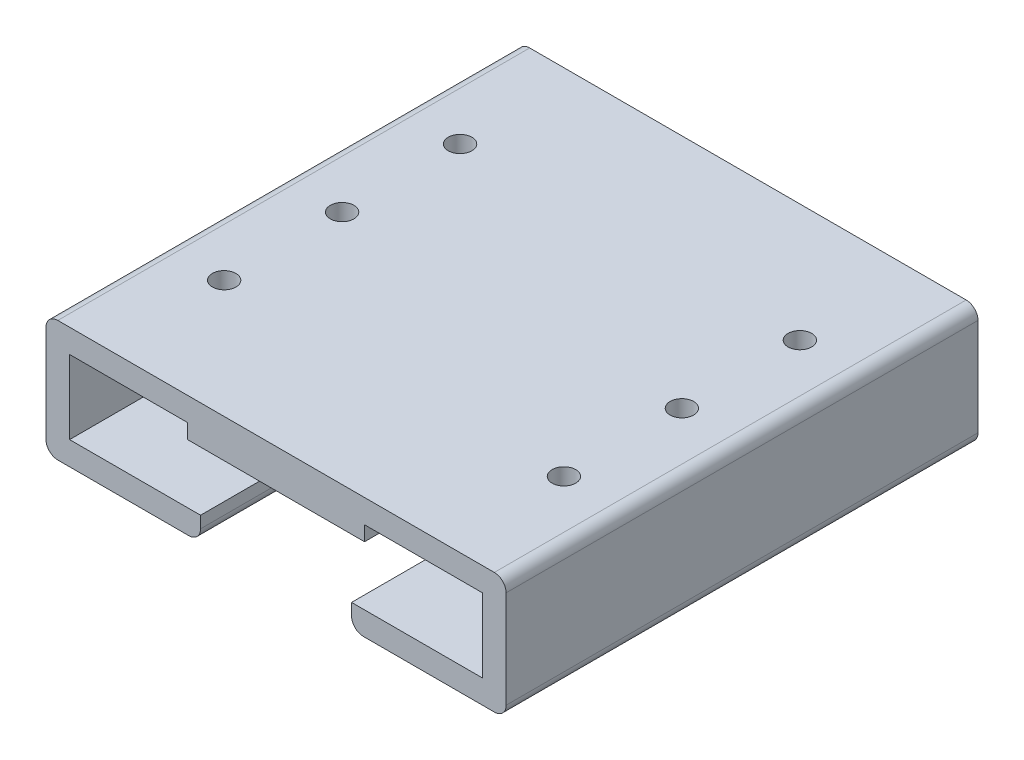
ISO-10303-21;
HEADER;
FILE_DESCRIPTION(('STEP AP214'),'2;1');
FILE_NAME('part.step','',(''),(''),'','','');
FILE_SCHEMA(('AUTOMOTIVE_DESIGN { 1 0 10303 214 1 1 1 1 }'));
ENDSEC;
DATA;
#1=APPLICATION_CONTEXT('core data for automotive mechanical design processes');
#2=APPLICATION_PROTOCOL_DEFINITION('international standard','automotive_design',2000,#1);
#3=PRODUCT_CONTEXT('',#1,'mechanical');
#4=PRODUCT('Part','Part','',(#3));
#5=PRODUCT_RELATED_PRODUCT_CATEGORY('part','',(#4));
#6=PRODUCT_DEFINITION_FORMATION('','',#4);
#7=PRODUCT_DEFINITION_CONTEXT('part definition',#1,'design');
#8=PRODUCT_DEFINITION('design','',#6,#7);
#9=PRODUCT_DEFINITION_SHAPE('','',#8);
#10=(LENGTH_UNIT() NAMED_UNIT(*) SI_UNIT(.MILLI.,.METRE.));
#11=(NAMED_UNIT(*) PLANE_ANGLE_UNIT() SI_UNIT($,.RADIAN.));
#12=(NAMED_UNIT(*) SI_UNIT($,.STERADIAN.) SOLID_ANGLE_UNIT());
#13=UNCERTAINTY_MEASURE_WITH_UNIT(LENGTH_MEASURE(1.E-05),#10,'distance_accuracy_value','');
#14=(GEOMETRIC_REPRESENTATION_CONTEXT(3) GLOBAL_UNCERTAINTY_ASSIGNED_CONTEXT((#13)) GLOBAL_UNIT_ASSIGNED_CONTEXT((#10,
#11,#12)) REPRESENTATION_CONTEXT('',''));
#15=CARTESIAN_POINT('',(0.,0.,0.));
#16=DIRECTION('',(0.,0.,1.));
#17=DIRECTION('',(1.,0.,0.));
#18=AXIS2_PLACEMENT_3D('',#15,#16,#17);
#19=CARTESIAN_POINT('',(15.,0.,80.));
#20=DIRECTION('',(-1.,0.,0.));
#21=DIRECTION('',(0.,0.,1.));
#22=AXIS2_PLACEMENT_3D('',#19,#20,#21);
#23=PLANE('',#22);
#24=DIRECTION('',(0.,1.,0.));
#25=VECTOR('',#24,1.);
#26=CARTESIAN_POINT('',(15.,0.,0.));
#27=LINE('',#26,#25);
#28=CARTESIAN_POINT('',(15.,0.,0.));
#29=VERTEX_POINT('',#28);
#30=CARTESIAN_POINT('',(15.,2.5,0.));
#31=VERTEX_POINT('',#30);
#32=EDGE_CURVE('E228',#29,#31,#27,.T.);
#33=ORIENTED_EDGE('',*,*,#32,.T.);
#34=DIRECTION('',(0.,0.,-1.));
#35=VECTOR('',#34,1.);
#36=CARTESIAN_POINT('',(15.,2.5,80.));
#37=LINE('',#36,#35);
#38=CARTESIAN_POINT('',(15.,2.5,80.));
#39=VERTEX_POINT('',#38);
#40=EDGE_CURVE('E11',#39,#31,#37,.T.);
#41=ORIENTED_EDGE('',*,*,#40,.F.);
#42=DIRECTION('',(0.,1.,0.));
#43=VECTOR('',#42,1.);
#44=CARTESIAN_POINT('',(15.,0.,80.));
#45=LINE('',#44,#43);
#46=CARTESIAN_POINT('',(15.,0.,80.));
#47=VERTEX_POINT('',#46);
#48=EDGE_CURVE('E294',#47,#39,#45,.T.);
#49=ORIENTED_EDGE('',*,*,#48,.F.);
#50=DIRECTION('',(0.,0.,-1.));
#51=VECTOR('',#50,1.);
#52=CARTESIAN_POINT('',(15.,0.,80.));
#53=LINE('',#52,#51);
#54=EDGE_CURVE('E224',#47,#29,#53,.T.);
#55=ORIENTED_EDGE('',*,*,#54,.T.);
#56=EDGE_LOOP('',(#33,#41,#49,#55));
#57=FACE_BOUND('',#56,.T.);
#58=ADVANCED_FACE('F43',(#57),#23,.F.);
#59=CARTESIAN_POINT('',(15.,2.5,80.));
#60=DIRECTION('',(0.,1.,0.));
#61=DIRECTION('',(-1.,0.,0.));
#62=AXIS2_PLACEMENT_3D('',#59,#60,#61);
#63=PLANE('',#62);
#64=CARTESIAN_POINT('',(28.8000000000004,2.50000000000001,20.));
#65=DIRECTION('',(0.,-1.,0.));
#66=DIRECTION('',(1.,0.,0.));
#67=AXIS2_PLACEMENT_3D('',#64,#65,#66);
#68=CIRCLE('',#67,2.00000000000001);
#69=CARTESIAN_POINT('',(30.8000000000004,2.50000000000001,20.));
#70=VERTEX_POINT('',#69);
#71=EDGE_CURVE('E564',#70,#70,#68,.T.);
#72=ORIENTED_EDGE('',*,*,#71,.F.);
#73=EDGE_LOOP('',(#72));
#74=FACE_BOUND('',#73,.T.);
#75=CARTESIAN_POINT('',(28.8000000000002,2.50000000000001,40.));
#76=DIRECTION('',(0.,-1.,0.));
#77=DIRECTION('',(1.,0.,0.));
#78=AXIS2_PLACEMENT_3D('',#75,#76,#77);
#79=CIRCLE('',#78,2.00000000000001);
#80=CARTESIAN_POINT('',(30.8000000000002,2.50000000000001,40.));
#81=VERTEX_POINT('',#80);
#82=EDGE_CURVE('E563',#81,#81,#79,.T.);
#83=ORIENTED_EDGE('',*,*,#82,.F.);
#84=EDGE_LOOP('',(#83));
#85=FACE_BOUND('',#84,.T.);
#86=CARTESIAN_POINT('',(28.8,2.50000000000001,60.));
#87=DIRECTION('',(0.,-1.,0.));
#88=DIRECTION('',(1.,0.,0.));
#89=AXIS2_PLACEMENT_3D('',#86,#87,#88);
#90=CIRCLE('',#89,2.00000000000001);
#91=CARTESIAN_POINT('',(30.8,2.50000000000001,60.));
#92=VERTEX_POINT('',#91);
#93=EDGE_CURVE('E544',#92,#92,#90,.T.);
#94=ORIENTED_EDGE('',*,*,#93,.F.);
#95=EDGE_LOOP('',(#94));
#96=FACE_BOUND('',#95,.T.);
#97=DIRECTION('',(1.,0.,0.));
#98=VECTOR('',#97,1.);
#99=CARTESIAN_POINT('',(15.,2.5,0.));
#100=LINE('',#99,#98);
#101=CARTESIAN_POINT('',(35.,2.5,0.));
#102=VERTEX_POINT('',#101);
#103=EDGE_CURVE('E232',#31,#102,#100,.T.);
#104=ORIENTED_EDGE('',*,*,#103,.T.);
#105=DIRECTION('',(0.,0.,-1.));
#106=VECTOR('',#105,1.);
#107=CARTESIAN_POINT('',(35.,2.5,80.));
#108=LINE('',#107,#106);
#109=CARTESIAN_POINT('',(35.,2.5,80.));
#110=VERTEX_POINT('',#109);
#111=EDGE_CURVE('E52',#110,#102,#108,.T.);
#112=ORIENTED_EDGE('',*,*,#111,.F.);
#113=DIRECTION('',(1.,0.,0.));
#114=VECTOR('',#113,1.);
#115=CARTESIAN_POINT('',(15.,2.5,80.));
#116=LINE('',#115,#114);
#117=EDGE_CURVE('E145',#39,#110,#116,.T.);
#118=ORIENTED_EDGE('',*,*,#117,.F.);
#119=ORIENTED_EDGE('',*,*,#40,.T.);
#120=EDGE_LOOP('',(#104,#112,#118,#119));
#121=FACE_BOUND('',#120,.T.);
#122=ADVANCED_FACE('F458',(#74,#85,#96,#121),#63,.F.);
#123=CARTESIAN_POINT('',(35.,2.5,80.));
#124=DIRECTION('',(1.,0.,0.));
#125=DIRECTION('',(0.,0.,-1.));
#126=AXIS2_PLACEMENT_3D('',#123,#124,#125);
#127=PLANE('',#126);
#128=DIRECTION('',(0.,-1.,0.));
#129=VECTOR('',#128,1.);
#130=CARTESIAN_POINT('',(35.,2.5,0.));
#131=LINE('',#130,#129);
#132=CARTESIAN_POINT('',(35.,-10.,0.));
#133=VERTEX_POINT('',#132);
#134=EDGE_CURVE('E236',#102,#133,#131,.T.);
#135=ORIENTED_EDGE('',*,*,#134,.T.);
#136=DIRECTION('',(0.,0.,-1.));
#137=VECTOR('',#136,1.);
#138=CARTESIAN_POINT('',(35.,-10.,80.));
#139=LINE('',#138,#137);
#140=CARTESIAN_POINT('',(35.,-10.,80.));
#141=VERTEX_POINT('',#140);
#142=EDGE_CURVE('E361',#141,#133,#139,.T.);
#143=ORIENTED_EDGE('',*,*,#142,.F.);
#144=DIRECTION('',(0.,-1.,0.));
#145=VECTOR('',#144,1.);
#146=CARTESIAN_POINT('',(35.,2.5,80.));
#147=LINE('',#146,#145);
#148=EDGE_CURVE('E371',#110,#141,#147,.T.);
#149=ORIENTED_EDGE('',*,*,#148,.F.);
#150=ORIENTED_EDGE('',*,*,#111,.T.);
#151=EDGE_LOOP('',(#135,#143,#149,#150));
#152=FACE_BOUND('',#151,.T.);
#153=ADVANCED_FACE('F369',(#152),#127,.F.);
#154=CARTESIAN_POINT('',(35.,-10.,80.));
#155=DIRECTION('',(0.,-1.,0.));
#156=DIRECTION('',(0.,0.,-1.));
#157=AXIS2_PLACEMENT_3D('',#154,#155,#156);
#158=PLANE('',#157);
#159=CARTESIAN_POINT('',(28.8,-10.,40.));
#160=DIRECTION('',(0.,1.,0.));
#161=DIRECTION('',(0.,0.,1.));
#162=AXIS2_PLACEMENT_3D('',#159,#160,#161);
#163=CIRCLE('',#162,2.00000000000001);
#164=CARTESIAN_POINT('',(28.8,-10.,42.));
#165=VERTEX_POINT('',#164);
#166=EDGE_CURVE('E591',#165,#165,#163,.T.);
#167=ORIENTED_EDGE('',*,*,#166,.F.);
#168=EDGE_LOOP('',(#167));
#169=FACE_BOUND('',#168,.T.);
#170=DIRECTION('',(-1.,0.,0.));
#171=VECTOR('',#170,1.);
#172=CARTESIAN_POINT('',(35.,-10.,0.));
#173=LINE('',#172,#171);
#174=CARTESIAN_POINT('',(12.8,-10.,0.));
#175=VERTEX_POINT('',#174);
#176=EDGE_CURVE('E239',#133,#175,#173,.T.);
#177=ORIENTED_EDGE('',*,*,#176,.T.);
#178=DIRECTION('',(0.,0.,-1.));
#179=VECTOR('',#178,1.);
#180=CARTESIAN_POINT('',(12.8,-10.,80.));
#181=LINE('',#180,#179);
#182=CARTESIAN_POINT('',(12.8,-10.,80.));
#183=VERTEX_POINT('',#182);
#184=EDGE_CURVE('E357',#183,#175,#181,.T.);
#185=ORIENTED_EDGE('',*,*,#184,.F.);
#186=DIRECTION('',(-1.,0.,0.));
#187=VECTOR('',#186,1.);
#188=CARTESIAN_POINT('',(35.,-10.,80.));
#189=LINE('',#188,#187);
#190=EDGE_CURVE('E390',#141,#183,#189,.T.);
#191=ORIENTED_EDGE('',*,*,#190,.F.);
#192=ORIENTED_EDGE('',*,*,#142,.T.);
#193=EDGE_LOOP('',(#177,#185,#191,#192));
#194=FACE_BOUND('',#193,.T.);
#195=ADVANCED_FACE('F380',(#169,#194),#158,.F.);
#196=CARTESIAN_POINT('',(12.8,-10.,80.));
#197=DIRECTION('',(1.,0.,0.));
#198=DIRECTION('',(0.,0.,-1.));
#199=AXIS2_PLACEMENT_3D('',#196,#197,#198);
#200=PLANE('',#199);
#201=DIRECTION('',(0.,-1.,0.));
#202=VECTOR('',#201,1.);
#203=CARTESIAN_POINT('',(12.8,-10.,0.));
#204=LINE('',#203,#202);
#205=CARTESIAN_POINT('',(12.8,-12.,0.));
#206=VERTEX_POINT('',#205);
#207=EDGE_CURVE('E242',#175,#206,#204,.T.);
#208=ORIENTED_EDGE('',*,*,#207,.T.);
#209=DIRECTION('',(0.,0.,-1.));
#210=VECTOR('',#209,1.);
#211=CARTESIAN_POINT('',(12.8,-12.,80.));
#212=LINE('',#211,#210);
#213=CARTESIAN_POINT('',(12.8,-12.,80.));
#214=VERTEX_POINT('',#213);
#215=EDGE_CURVE('E353',#214,#206,#212,.T.);
#216=ORIENTED_EDGE('',*,*,#215,.F.);
#217=DIRECTION('',(0.,-1.,0.));
#218=VECTOR('',#217,1.);
#219=CARTESIAN_POINT('',(12.8,-10.,80.));
#220=LINE('',#219,#218);
#221=EDGE_CURVE('E386',#183,#214,#220,.T.);
#222=ORIENTED_EDGE('',*,*,#221,.F.);
#223=ORIENTED_EDGE('',*,*,#184,.T.);
#224=EDGE_LOOP('',(#208,#216,#222,#223));
#225=FACE_BOUND('',#224,.T.);
#226=ADVANCED_FACE('F384',(#225),#200,.F.);
#227=CARTESIAN_POINT('',(14.8,-12.,80.));
#228=DIRECTION('',(0.,0.,-1.));
#229=DIRECTION('',(-1.,0.,0.));
#230=AXIS2_PLACEMENT_3D('',#227,#228,#229);
#231=CYLINDRICAL_SURFACE('',#230,2.);
#232=CARTESIAN_POINT('',(14.8,-12.,0.));
#233=DIRECTION('',(0.,0.,1.));
#234=DIRECTION('',(-1.,0.,0.));
#235=AXIS2_PLACEMENT_3D('',#232,#233,#234);
#236=CIRCLE('',#235,2.);
#237=CARTESIAN_POINT('',(14.8,-14.,0.));
#238=VERTEX_POINT('',#237);
#239=EDGE_CURVE('E245',#206,#238,#236,.T.);
#240=ORIENTED_EDGE('',*,*,#239,.T.);
#241=DIRECTION('',(0.,0.,-1.));
#242=VECTOR('',#241,1.);
#243=CARTESIAN_POINT('',(14.8,-14.,80.));
#244=LINE('',#243,#242);
#245=CARTESIAN_POINT('',(14.8,-14.,80.));
#246=VERTEX_POINT('',#245);
#247=EDGE_CURVE('E349',#246,#238,#244,.T.);
#248=ORIENTED_EDGE('',*,*,#247,.F.);
#249=CARTESIAN_POINT('',(14.8,-12.,80.));
#250=DIRECTION('',(0.,0.,1.));
#251=DIRECTION('',(-1.,0.,0.));
#252=AXIS2_PLACEMENT_3D('',#249,#250,#251);
#253=CIRCLE('',#252,2.);
#254=EDGE_CURVE('E389',#214,#246,#253,.T.);
#255=ORIENTED_EDGE('',*,*,#254,.F.);
#256=ORIENTED_EDGE('',*,*,#215,.T.);
#257=EDGE_LOOP('',(#240,#248,#255,#256));
#258=FACE_BOUND('',#257,.T.);
#259=ADVANCED_FACE('F475',(#258),#231,.T.);
#260=CARTESIAN_POINT('',(37.,-14.,80.));
#261=DIRECTION('',(0.,1.,0.));
#262=DIRECTION('',(-1.,0.,0.));
#263=AXIS2_PLACEMENT_3D('',#260,#261,#262);
#264=PLANE('',#263);
#265=CARTESIAN_POINT('',(28.8,-14.,40.));
#266=DIRECTION('',(0.,1.,0.));
#267=DIRECTION('',(0.,0.,1.));
#268=AXIS2_PLACEMENT_3D('',#265,#266,#267);
#269=CIRCLE('',#268,2.00000000000001);
#270=CARTESIAN_POINT('',(28.8,-14.,42.));
#271=VERTEX_POINT('',#270);
#272=EDGE_CURVE('E588',#271,#271,#269,.T.);
#273=ORIENTED_EDGE('',*,*,#272,.T.);
#274=EDGE_LOOP('',(#273));
#275=FACE_BOUND('',#274,.T.);
#276=DIRECTION('',(1.,0.,0.));
#277=VECTOR('',#276,1.);
#278=CARTESIAN_POINT('',(37.,-14.,0.));
#279=LINE('',#278,#277);
#280=CARTESIAN_POINT('',(37.,-14.,0.));
#281=VERTEX_POINT('',#280);
#282=EDGE_CURVE('E248',#238,#281,#279,.T.);
#283=ORIENTED_EDGE('',*,*,#282,.T.);
#284=DIRECTION('',(0.,0.,-1.));
#285=VECTOR('',#284,1.);
#286=CARTESIAN_POINT('',(37.,-14.,80.));
#287=LINE('',#286,#285);
#288=CARTESIAN_POINT('',(37.,-14.,80.));
#289=VERTEX_POINT('',#288);
#290=EDGE_CURVE('E345',#289,#281,#287,.T.);
#291=ORIENTED_EDGE('',*,*,#290,.F.);
#292=DIRECTION('',(1.,0.,0.));
#293=VECTOR('',#292,1.);
#294=CARTESIAN_POINT('',(37.,-14.,80.));
#295=LINE('',#294,#293);
#296=EDGE_CURVE('E394',#246,#289,#295,.T.);
#297=ORIENTED_EDGE('',*,*,#296,.F.);
#298=ORIENTED_EDGE('',*,*,#247,.T.);
#299=EDGE_LOOP('',(#283,#291,#297,#298));
#300=FACE_BOUND('',#299,.T.);
#301=ADVANCED_FACE('F478',(#275,#300),#264,.F.);
#302=CARTESIAN_POINT('',(37.,-12.,80.));
#303=DIRECTION('',(0.,0.,-1.));
#304=DIRECTION('',(-1.,0.,0.));
#305=AXIS2_PLACEMENT_3D('',#302,#303,#304);
#306=CYLINDRICAL_SURFACE('',#305,2.);
#307=CARTESIAN_POINT('',(37.,-12.,0.));
#308=DIRECTION('',(0.,0.,1.));
#309=DIRECTION('',(-1.,0.,0.));
#310=AXIS2_PLACEMENT_3D('',#307,#308,#309);
#311=CIRCLE('',#310,2.);
#312=CARTESIAN_POINT('',(39.,-12.,0.));
#313=VERTEX_POINT('',#312);
#314=EDGE_CURVE('E251',#281,#313,#311,.T.);
#315=ORIENTED_EDGE('',*,*,#314,.T.);
#316=DIRECTION('',(0.,0.,-1.));
#317=VECTOR('',#316,1.);
#318=CARTESIAN_POINT('',(39.,-12.,80.));
#319=LINE('',#318,#317);
#320=CARTESIAN_POINT('',(39.,-12.,80.));
#321=VERTEX_POINT('',#320);
#322=EDGE_CURVE('E341',#321,#313,#319,.T.);
#323=ORIENTED_EDGE('',*,*,#322,.F.);
#324=CARTESIAN_POINT('',(37.,-12.,80.));
#325=DIRECTION('',(0.,0.,1.));
#326=DIRECTION('',(-1.,0.,0.));
#327=AXIS2_PLACEMENT_3D('',#324,#325,#326);
#328=CIRCLE('',#327,2.);
#329=EDGE_CURVE('E401',#289,#321,#328,.T.);
#330=ORIENTED_EDGE('',*,*,#329,.F.);
#331=ORIENTED_EDGE('',*,*,#290,.T.);
#332=EDGE_LOOP('',(#315,#323,#330,#331));
#333=FACE_BOUND('',#332,.T.);
#334=ADVANCED_FACE('F482',(#333),#306,.T.);
#335=CARTESIAN_POINT('',(39.,4.49999999999998,80.));
#336=DIRECTION('',(-1.,0.,0.));
#337=DIRECTION('',(0.,0.,1.));
#338=AXIS2_PLACEMENT_3D('',#335,#336,#337);
#339=PLANE('',#338);
#340=DIRECTION('',(0.,1.,0.));
#341=VECTOR('',#340,1.);
#342=CARTESIAN_POINT('',(39.,4.49999999999998,0.));
#343=LINE('',#342,#341);
#344=CARTESIAN_POINT('',(39.,4.49999999999998,0.));
#345=VERTEX_POINT('',#344);
#346=EDGE_CURVE('E254',#313,#345,#343,.T.);
#347=ORIENTED_EDGE('',*,*,#346,.T.);
#348=DIRECTION('',(0.,0.,-1.));
#349=VECTOR('',#348,1.);
#350=CARTESIAN_POINT('',(39.,4.49999999999998,80.));
#351=LINE('',#350,#349);
#352=CARTESIAN_POINT('',(39.,4.49999999999998,80.));
#353=VERTEX_POINT('',#352);
#354=EDGE_CURVE('E337',#353,#345,#351,.T.);
#355=ORIENTED_EDGE('',*,*,#354,.F.);
#356=DIRECTION('',(0.,1.,0.));
#357=VECTOR('',#356,1.);
#358=CARTESIAN_POINT('',(39.,4.49999999999998,80.));
#359=LINE('',#358,#357);
#360=EDGE_CURVE('E404',#321,#353,#359,.T.);
#361=ORIENTED_EDGE('',*,*,#360,.F.);
#362=ORIENTED_EDGE('',*,*,#322,.T.);
#363=EDGE_LOOP('',(#347,#355,#361,#362));
#364=FACE_BOUND('',#363,.T.);
#365=ADVANCED_FACE('F486',(#364),#339,.F.);
#366=CARTESIAN_POINT('',(37.,4.5,80.));
#367=DIRECTION('',(0.,0.,-1.));
#368=DIRECTION('',(-1.,0.,0.));
#369=AXIS2_PLACEMENT_3D('',#366,#367,#368);
#370=CYLINDRICAL_SURFACE('',#369,2.);
#371=CARTESIAN_POINT('',(37.,4.5,0.));
#372=DIRECTION('',(0.,0.,1.));
#373=DIRECTION('',(-1.,0.,0.));
#374=AXIS2_PLACEMENT_3D('',#371,#372,#373);
#375=CIRCLE('',#374,2.);
#376=CARTESIAN_POINT('',(37.,6.5,0.));
#377=VERTEX_POINT('',#376);
#378=EDGE_CURVE('E257',#345,#377,#375,.T.);
#379=ORIENTED_EDGE('',*,*,#378,.T.);
#380=DIRECTION('',(0.,0.,-1.));
#381=VECTOR('',#380,1.);
#382=CARTESIAN_POINT('',(37.,6.5,80.));
#383=LINE('',#382,#381);
#384=CARTESIAN_POINT('',(37.,6.5,80.));
#385=VERTEX_POINT('',#384);
#386=EDGE_CURVE('E333',#385,#377,#383,.T.);
#387=ORIENTED_EDGE('',*,*,#386,.F.);
#388=CARTESIAN_POINT('',(37.,4.5,80.));
#389=DIRECTION('',(0.,0.,1.));
#390=DIRECTION('',(-1.,0.,0.));
#391=AXIS2_PLACEMENT_3D('',#388,#389,#390);
#392=CIRCLE('',#391,2.);
#393=EDGE_CURVE('E407',#353,#385,#392,.T.);
#394=ORIENTED_EDGE('',*,*,#393,.F.);
#395=ORIENTED_EDGE('',*,*,#354,.T.);
#396=EDGE_LOOP('',(#379,#387,#394,#395));
#397=FACE_BOUND('',#396,.T.);
#398=ADVANCED_FACE('F490',(#397),#370,.T.);
#399=CARTESIAN_POINT('',(-15.,6.5,80.));
#400=DIRECTION('',(0.,-1.,0.));
#401=DIRECTION('',(0.,0.,-1.));
#402=AXIS2_PLACEMENT_3D('',#399,#400,#401);
#403=PLANE('',#402);
#404=CARTESIAN_POINT('',(-28.7999999999998,6.5,40.));
#405=DIRECTION('',(0.,-1.,0.));
#406=DIRECTION('',(1.,0.,0.));
#407=AXIS2_PLACEMENT_3D('',#404,#405,#406);
#408=CIRCLE('',#407,2.00000000000001);
#409=CARTESIAN_POINT('',(-26.7999999999998,6.5,40.));
#410=VERTEX_POINT('',#409);
#411=EDGE_CURVE('E571',#410,#410,#408,.T.);
#412=ORIENTED_EDGE('',*,*,#411,.T.);
#413=EDGE_LOOP('',(#412));
#414=FACE_BOUND('',#413,.T.);
#415=CARTESIAN_POINT('',(28.8000000000004,6.50000000000001,20.));
#416=DIRECTION('',(0.,-1.,0.));
#417=DIRECTION('',(1.,0.,0.));
#418=AXIS2_PLACEMENT_3D('',#415,#416,#417);
#419=CIRCLE('',#418,2.00000000000001);
#420=CARTESIAN_POINT('',(30.8000000000004,6.50000000000001,20.));
#421=VERTEX_POINT('',#420);
#422=EDGE_CURVE('E577',#421,#421,#419,.T.);
#423=ORIENTED_EDGE('',*,*,#422,.T.);
#424=EDGE_LOOP('',(#423));
#425=FACE_BOUND('',#424,.T.);
#426=CARTESIAN_POINT('',(28.8000000000002,6.50000000000001,40.));
#427=DIRECTION('',(0.,-1.,0.));
#428=DIRECTION('',(1.,0.,0.));
#429=AXIS2_PLACEMENT_3D('',#426,#427,#428);
#430=CIRCLE('',#429,2.00000000000001);
#431=CARTESIAN_POINT('',(30.8000000000002,6.50000000000001,40.));
#432=VERTEX_POINT('',#431);
#433=EDGE_CURVE('E559',#432,#432,#430,.T.);
#434=ORIENTED_EDGE('',*,*,#433,.T.);
#435=EDGE_LOOP('',(#434));
#436=FACE_BOUND('',#435,.T.);
#437=CARTESIAN_POINT('',(28.8,6.50000000000001,60.));
#438=DIRECTION('',(0.,-1.,0.));
#439=DIRECTION('',(1.,0.,0.));
#440=AXIS2_PLACEMENT_3D('',#437,#438,#439);
#441=CIRCLE('',#440,2.00000000000001);
#442=CARTESIAN_POINT('',(30.8,6.50000000000001,60.));
#443=VERTEX_POINT('',#442);
#444=EDGE_CURVE('E551',#443,#443,#441,.T.);
#445=ORIENTED_EDGE('',*,*,#444,.T.);
#446=EDGE_LOOP('',(#445));
#447=FACE_BOUND('',#446,.T.);
#448=CARTESIAN_POINT('',(-28.7999999999996,6.5,20.));
#449=DIRECTION('',(0.,-1.,0.));
#450=DIRECTION('',(1.,0.,0.));
#451=AXIS2_PLACEMENT_3D('',#448,#449,#450);
#452=CIRCLE('',#451,2.00000000000001);
#453=CARTESIAN_POINT('',(-26.7999999999996,6.5,20.));
#454=VERTEX_POINT('',#453);
#455=EDGE_CURVE('E584',#454,#454,#452,.T.);
#456=ORIENTED_EDGE('',*,*,#455,.T.);
#457=EDGE_LOOP('',(#456));
#458=FACE_BOUND('',#457,.T.);
#459=CARTESIAN_POINT('',(-28.8,6.5,60.));
#460=DIRECTION('',(0.,-1.,0.));
#461=DIRECTION('',(1.,0.,0.));
#462=AXIS2_PLACEMENT_3D('',#459,#460,#461);
#463=CIRCLE('',#462,2.00000000000001);
#464=CARTESIAN_POINT('',(-26.8,6.5,60.));
#465=VERTEX_POINT('',#464);
#466=EDGE_CURVE('E233',#465,#465,#463,.T.);
#467=ORIENTED_EDGE('',*,*,#466,.T.);
#468=EDGE_LOOP('',(#467));
#469=FACE_BOUND('',#468,.T.);
#470=DIRECTION('',(-1.,0.,0.));
#471=VECTOR('',#470,1.);
#472=CARTESIAN_POINT('',(-15.,6.5,0.));
#473=LINE('',#472,#471);
#474=CARTESIAN_POINT('',(-37.,6.5,0.));
#475=VERTEX_POINT('',#474);
#476=EDGE_CURVE('E261',#377,#475,#473,.T.);
#477=ORIENTED_EDGE('',*,*,#476,.T.);
#478=DIRECTION('',(0.,0.,-1.));
#479=VECTOR('',#478,1.);
#480=CARTESIAN_POINT('',(-37.,6.5,80.));
#481=LINE('',#480,#479);
#482=CARTESIAN_POINT('',(-37.,6.5,80.));
#483=VERTEX_POINT('',#482);
#484=EDGE_CURVE('E329',#483,#475,#481,.T.);
#485=ORIENTED_EDGE('',*,*,#484,.F.);
#486=DIRECTION('',(-1.,0.,0.));
#487=VECTOR('',#486,1.);
#488=CARTESIAN_POINT('',(15.,6.5,80.));
#489=LINE('',#488,#487);
#490=EDGE_CURVE('E410',#385,#483,#489,.T.);
#491=ORIENTED_EDGE('',*,*,#490,.F.);
#492=ORIENTED_EDGE('',*,*,#386,.T.);
#493=EDGE_LOOP('',(#477,#485,#491,#492));
#494=FACE_BOUND('',#493,.T.);
#495=ADVANCED_FACE('F494',(#414,#425,#436,#447,#458,#469,#494),#403,.F.);
#496=CARTESIAN_POINT('',(-37.,4.5,80.));
#497=DIRECTION('',(0.,0.,-1.));
#498=DIRECTION('',(-1.,0.,0.));
#499=AXIS2_PLACEMENT_3D('',#496,#497,#498);
#500=CYLINDRICAL_SURFACE('',#499,2.);
#501=CARTESIAN_POINT('',(-37.,4.5,0.));
#502=DIRECTION('',(0.,0.,1.));
#503=DIRECTION('',(1.,0.,0.));
#504=AXIS2_PLACEMENT_3D('',#501,#502,#503);
#505=CIRCLE('',#504,2.);
#506=CARTESIAN_POINT('',(-39.,4.49999999999999,0.));
#507=VERTEX_POINT('',#506);
#508=EDGE_CURVE('E264',#475,#507,#505,.T.);
#509=ORIENTED_EDGE('',*,*,#508,.T.);
#510=DIRECTION('',(0.,0.,-1.));
#511=VECTOR('',#510,1.);
#512=CARTESIAN_POINT('',(-39.,4.49999999999999,80.));
#513=LINE('',#512,#511);
#514=CARTESIAN_POINT('',(-39.,4.49999999999999,80.));
#515=VERTEX_POINT('',#514);
#516=EDGE_CURVE('E325',#515,#507,#513,.T.);
#517=ORIENTED_EDGE('',*,*,#516,.F.);
#518=CARTESIAN_POINT('',(-37.,4.5,80.));
#519=DIRECTION('',(0.,0.,1.));
#520=DIRECTION('',(1.,0.,0.));
#521=AXIS2_PLACEMENT_3D('',#518,#519,#520);
#522=CIRCLE('',#521,2.);
#523=EDGE_CURVE('E413',#483,#515,#522,.T.);
#524=ORIENTED_EDGE('',*,*,#523,.F.);
#525=ORIENTED_EDGE('',*,*,#484,.T.);
#526=EDGE_LOOP('',(#509,#517,#524,#525));
#527=FACE_BOUND('',#526,.T.);
#528=ADVANCED_FACE('F498',(#527),#500,.T.);
#529=CARTESIAN_POINT('',(-39.,4.49999999999999,80.));
#530=DIRECTION('',(1.,0.,0.));
#531=DIRECTION('',(0.,0.,-1.));
#532=AXIS2_PLACEMENT_3D('',#529,#530,#531);
#533=PLANE('',#532);
#534=DIRECTION('',(0.,-1.,0.));
#535=VECTOR('',#534,1.);
#536=CARTESIAN_POINT('',(-39.,4.49999999999999,0.));
#537=LINE('',#536,#535);
#538=CARTESIAN_POINT('',(-39.,-12.,0.));
#539=VERTEX_POINT('',#538);
#540=EDGE_CURVE('E267',#507,#539,#537,.T.);
#541=ORIENTED_EDGE('',*,*,#540,.T.);
#542=DIRECTION('',(0.,0.,-1.));
#543=VECTOR('',#542,1.);
#544=CARTESIAN_POINT('',(-39.,-12.,80.));
#545=LINE('',#544,#543);
#546=CARTESIAN_POINT('',(-39.,-12.,80.));
#547=VERTEX_POINT('',#546);
#548=EDGE_CURVE('E321',#547,#539,#545,.T.);
#549=ORIENTED_EDGE('',*,*,#548,.F.);
#550=DIRECTION('',(0.,-1.,0.));
#551=VECTOR('',#550,1.);
#552=CARTESIAN_POINT('',(-39.,4.49999999999999,80.));
#553=LINE('',#552,#551);
#554=EDGE_CURVE('E416',#515,#547,#553,.T.);
#555=ORIENTED_EDGE('',*,*,#554,.F.);
#556=ORIENTED_EDGE('',*,*,#516,.T.);
#557=EDGE_LOOP('',(#541,#549,#555,#556));
#558=FACE_BOUND('',#557,.T.);
#559=ADVANCED_FACE('F502',(#558),#533,.F.);
#560=CARTESIAN_POINT('',(-37.,-12.,80.));
#561=DIRECTION('',(0.,0.,-1.));
#562=DIRECTION('',(-1.,0.,0.));
#563=AXIS2_PLACEMENT_3D('',#560,#561,#562);
#564=CYLINDRICAL_SURFACE('',#563,2.);
#565=CARTESIAN_POINT('',(-37.,-12.,0.));
#566=DIRECTION('',(0.,0.,1.));
#567=DIRECTION('',(1.,0.,0.));
#568=AXIS2_PLACEMENT_3D('',#565,#566,#567);
#569=CIRCLE('',#568,2.);
#570=CARTESIAN_POINT('',(-37.,-14.,0.));
#571=VERTEX_POINT('',#570);
#572=EDGE_CURVE('E270',#539,#571,#569,.T.);
#573=ORIENTED_EDGE('',*,*,#572,.T.);
#574=DIRECTION('',(0.,0.,-1.));
#575=VECTOR('',#574,1.);
#576=CARTESIAN_POINT('',(-37.,-14.,80.));
#577=LINE('',#576,#575);
#578=CARTESIAN_POINT('',(-37.,-14.,80.));
#579=VERTEX_POINT('',#578);
#580=EDGE_CURVE('E317',#579,#571,#577,.T.);
#581=ORIENTED_EDGE('',*,*,#580,.F.);
#582=CARTESIAN_POINT('',(-37.,-12.,80.));
#583=DIRECTION('',(0.,0.,1.));
#584=DIRECTION('',(1.,0.,0.));
#585=AXIS2_PLACEMENT_3D('',#582,#583,#584);
#586=CIRCLE('',#585,2.);
#587=EDGE_CURVE('E419',#547,#579,#586,.T.);
#588=ORIENTED_EDGE('',*,*,#587,.F.);
#589=ORIENTED_EDGE('',*,*,#548,.T.);
#590=EDGE_LOOP('',(#573,#581,#588,#589));
#591=FACE_BOUND('',#590,.T.);
#592=ADVANCED_FACE('F506',(#591),#564,.T.);
#593=CARTESIAN_POINT('',(-37.,-14.,80.));
#594=DIRECTION('',(0.,1.,0.));
#595=DIRECTION('',(-1.,0.,0.));
#596=AXIS2_PLACEMENT_3D('',#593,#594,#595);
#597=PLANE('',#596);
#598=DIRECTION('',(1.,0.,0.));
#599=VECTOR('',#598,1.);
#600=CARTESIAN_POINT('',(-37.,-14.,0.));
#601=LINE('',#600,#599);
#602=CARTESIAN_POINT('',(-14.8,-14.,0.));
#603=VERTEX_POINT('',#602);
#604=EDGE_CURVE('E273',#571,#603,#601,.T.);
#605=ORIENTED_EDGE('',*,*,#604,.T.);
#606=DIRECTION('',(0.,0.,-1.));
#607=VECTOR('',#606,1.);
#608=CARTESIAN_POINT('',(-14.8,-14.,80.));
#609=LINE('',#608,#607);
#610=CARTESIAN_POINT('',(-14.8,-14.,80.));
#611=VERTEX_POINT('',#610);
#612=EDGE_CURVE('E313',#611,#603,#609,.T.);
#613=ORIENTED_EDGE('',*,*,#612,.F.);
#614=DIRECTION('',(1.,0.,0.));
#615=VECTOR('',#614,1.);
#616=CARTESIAN_POINT('',(-37.,-14.,80.));
#617=LINE('',#616,#615);
#618=EDGE_CURVE('E422',#579,#611,#617,.T.);
#619=ORIENTED_EDGE('',*,*,#618,.F.);
#620=ORIENTED_EDGE('',*,*,#580,.T.);
#621=EDGE_LOOP('',(#605,#613,#619,#620));
#622=FACE_BOUND('',#621,.T.);
#623=ADVANCED_FACE('F510',(#622),#597,.F.);
#624=CARTESIAN_POINT('',(-14.8,-12.,80.));
#625=DIRECTION('',(0.,0.,-1.));
#626=DIRECTION('',(-1.,0.,0.));
#627=AXIS2_PLACEMENT_3D('',#624,#625,#626);
#628=CYLINDRICAL_SURFACE('',#627,2.);
#629=CARTESIAN_POINT('',(-14.8,-12.,0.));
#630=DIRECTION('',(0.,0.,1.));
#631=DIRECTION('',(1.,0.,0.));
#632=AXIS2_PLACEMENT_3D('',#629,#630,#631);
#633=CIRCLE('',#632,2.);
#634=CARTESIAN_POINT('',(-12.8,-12.,0.));
#635=VERTEX_POINT('',#634);
#636=EDGE_CURVE('E276',#603,#635,#633,.T.);
#637=ORIENTED_EDGE('',*,*,#636,.T.);
#638=DIRECTION('',(0.,0.,-1.));
#639=VECTOR('',#638,1.);
#640=CARTESIAN_POINT('',(-12.8,-12.,80.));
#641=LINE('',#640,#639);
#642=CARTESIAN_POINT('',(-12.8,-12.,80.));
#643=VERTEX_POINT('',#642);
#644=EDGE_CURVE('E309',#643,#635,#641,.T.);
#645=ORIENTED_EDGE('',*,*,#644,.F.);
#646=CARTESIAN_POINT('',(-14.8,-12.,80.));
#647=DIRECTION('',(0.,0.,1.));
#648=DIRECTION('',(1.,0.,0.));
#649=AXIS2_PLACEMENT_3D('',#646,#647,#648);
#650=CIRCLE('',#649,2.);
#651=EDGE_CURVE('E425',#611,#643,#650,.T.);
#652=ORIENTED_EDGE('',*,*,#651,.F.);
#653=ORIENTED_EDGE('',*,*,#612,.T.);
#654=EDGE_LOOP('',(#637,#645,#652,#653));
#655=FACE_BOUND('',#654,.T.);
#656=ADVANCED_FACE('F514',(#655),#628,.T.);
#657=CARTESIAN_POINT('',(-12.8,-10.,80.));
#658=DIRECTION('',(-1.,0.,0.));
#659=DIRECTION('',(0.,0.,1.));
#660=AXIS2_PLACEMENT_3D('',#657,#658,#659);
#661=PLANE('',#660);
#662=DIRECTION('',(0.,1.,0.));
#663=VECTOR('',#662,1.);
#664=CARTESIAN_POINT('',(-12.8,-10.,0.));
#665=LINE('',#664,#663);
#666=CARTESIAN_POINT('',(-12.8,-10.,0.));
#667=VERTEX_POINT('',#666);
#668=EDGE_CURVE('E279',#635,#667,#665,.T.);
#669=ORIENTED_EDGE('',*,*,#668,.T.);
#670=DIRECTION('',(0.,0.,-1.));
#671=VECTOR('',#670,1.);
#672=CARTESIAN_POINT('',(-12.8,-10.,80.));
#673=LINE('',#672,#671);
#674=CARTESIAN_POINT('',(-12.8,-10.,80.));
#675=VERTEX_POINT('',#674);
#676=EDGE_CURVE('E305',#675,#667,#673,.T.);
#677=ORIENTED_EDGE('',*,*,#676,.F.);
#678=DIRECTION('',(0.,1.,0.));
#679=VECTOR('',#678,1.);
#680=CARTESIAN_POINT('',(-12.8,-10.,80.));
#681=LINE('',#680,#679);
#682=EDGE_CURVE('E428',#643,#675,#681,.T.);
#683=ORIENTED_EDGE('',*,*,#682,.F.);
#684=ORIENTED_EDGE('',*,*,#644,.T.);
#685=EDGE_LOOP('',(#669,#677,#683,#684));
#686=FACE_BOUND('',#685,.T.);
#687=ADVANCED_FACE('F518',(#686),#661,.F.);
#688=CARTESIAN_POINT('',(-35.,-10.,80.));
#689=DIRECTION('',(0.,-1.,0.));
#690=DIRECTION('',(0.,0.,-1.));
#691=AXIS2_PLACEMENT_3D('',#688,#689,#690);
#692=PLANE('',#691);
#693=DIRECTION('',(-1.,0.,0.));
#694=VECTOR('',#693,1.);
#695=CARTESIAN_POINT('',(-35.,-10.,0.));
#696=LINE('',#695,#694);
#697=CARTESIAN_POINT('',(-35.,-10.,0.));
#698=VERTEX_POINT('',#697);
#699=EDGE_CURVE('E282',#667,#698,#696,.T.);
#700=ORIENTED_EDGE('',*,*,#699,.T.);
#701=DIRECTION('',(0.,0.,-1.));
#702=VECTOR('',#701,1.);
#703=CARTESIAN_POINT('',(-35.,-10.,80.));
#704=LINE('',#703,#702);
#705=CARTESIAN_POINT('',(-35.,-10.,80.));
#706=VERTEX_POINT('',#705);
#707=EDGE_CURVE('E301',#706,#698,#704,.T.);
#708=ORIENTED_EDGE('',*,*,#707,.F.);
#709=DIRECTION('',(-1.,0.,0.));
#710=VECTOR('',#709,1.);
#711=CARTESIAN_POINT('',(-35.,-10.,80.));
#712=LINE('',#711,#710);
#713=EDGE_CURVE('E431',#675,#706,#712,.T.);
#714=ORIENTED_EDGE('',*,*,#713,.F.);
#715=ORIENTED_EDGE('',*,*,#676,.T.);
#716=EDGE_LOOP('',(#700,#708,#714,#715));
#717=FACE_BOUND('',#716,.T.);
#718=ADVANCED_FACE('F439',(#717),#692,.F.);
#719=CARTESIAN_POINT('',(-35.,2.5,80.));
#720=DIRECTION('',(-1.,0.,0.));
#721=DIRECTION('',(0.,0.,1.));
#722=AXIS2_PLACEMENT_3D('',#719,#720,#721);
#723=PLANE('',#722);
#724=DIRECTION('',(0.,1.,0.));
#725=VECTOR('',#724,1.);
#726=CARTESIAN_POINT('',(-35.,2.5,0.));
#727=LINE('',#726,#725);
#728=CARTESIAN_POINT('',(-35.,2.5,0.));
#729=VERTEX_POINT('',#728);
#730=EDGE_CURVE('E285',#698,#729,#727,.T.);
#731=ORIENTED_EDGE('',*,*,#730,.T.);
#732=DIRECTION('',(0.,0.,-1.));
#733=VECTOR('',#732,1.);
#734=CARTESIAN_POINT('',(-35.,2.5,80.));
#735=LINE('',#734,#733);
#736=CARTESIAN_POINT('',(-35.,2.5,80.));
#737=VERTEX_POINT('',#736);
#738=EDGE_CURVE('E217',#737,#729,#735,.T.);
#739=ORIENTED_EDGE('',*,*,#738,.F.);
#740=DIRECTION('',(0.,1.,0.));
#741=VECTOR('',#740,1.);
#742=CARTESIAN_POINT('',(-35.,2.5,80.));
#743=LINE('',#742,#741);
#744=EDGE_CURVE('E206',#706,#737,#743,.T.);
#745=ORIENTED_EDGE('',*,*,#744,.F.);
#746=ORIENTED_EDGE('',*,*,#707,.T.);
#747=EDGE_LOOP('',(#731,#739,#745,#746));
#748=FACE_BOUND('',#747,.T.);
#749=ADVANCED_FACE('F443',(#748),#723,.F.);
#750=CARTESIAN_POINT('',(-15.,2.5,80.));
#751=DIRECTION('',(0.,1.,0.));
#752=DIRECTION('',(-1.,0.,0.));
#753=AXIS2_PLACEMENT_3D('',#750,#751,#752);
#754=PLANE('',#753);
#755=CARTESIAN_POINT('',(-28.7999999999998,2.5,40.));
#756=DIRECTION('',(0.,-1.,0.));
#757=DIRECTION('',(1.,0.,0.));
#758=AXIS2_PLACEMENT_3D('',#755,#756,#757);
#759=CIRCLE('',#758,2.00000000000001);
#760=CARTESIAN_POINT('',(-26.7999999999998,2.5,40.));
#761=VERTEX_POINT('',#760);
#762=EDGE_CURVE('E534',#761,#761,#759,.T.);
#763=ORIENTED_EDGE('',*,*,#762,.F.);
#764=EDGE_LOOP('',(#763));
#765=FACE_BOUND('',#764,.T.);
#766=CARTESIAN_POINT('',(-28.7999999999996,2.5,20.));
#767=DIRECTION('',(0.,-1.,0.));
#768=DIRECTION('',(1.,0.,0.));
#769=AXIS2_PLACEMENT_3D('',#766,#767,#768);
#770=CIRCLE('',#769,2.00000000000001);
#771=CARTESIAN_POINT('',(-26.7999999999996,2.5,20.));
#772=VERTEX_POINT('',#771);
#773=EDGE_CURVE('E538',#772,#772,#770,.T.);
#774=ORIENTED_EDGE('',*,*,#773,.F.);
#775=EDGE_LOOP('',(#774));
#776=FACE_BOUND('',#775,.T.);
#777=CARTESIAN_POINT('',(-28.8,2.5,60.));
#778=DIRECTION('',(0.,-1.,0.));
#779=DIRECTION('',(1.,0.,0.));
#780=AXIS2_PLACEMENT_3D('',#777,#778,#779);
#781=CIRCLE('',#780,2.00000000000001);
#782=CARTESIAN_POINT('',(-26.8,2.5,60.));
#783=VERTEX_POINT('',#782);
#784=EDGE_CURVE('E541',#783,#783,#781,.T.);
#785=ORIENTED_EDGE('',*,*,#784,.F.);
#786=EDGE_LOOP('',(#785));
#787=FACE_BOUND('',#786,.T.);
#788=DIRECTION('',(1.,0.,0.));
#789=VECTOR('',#788,1.);
#790=CARTESIAN_POINT('',(-15.,2.5,0.));
#791=LINE('',#790,#789);
#792=CARTESIAN_POINT('',(-15.,2.5,0.));
#793=VERTEX_POINT('',#792);
#794=EDGE_CURVE('E215',#729,#793,#791,.T.);
#795=ORIENTED_EDGE('',*,*,#794,.T.);
#796=DIRECTION('',(0.,0.,-1.));
#797=VECTOR('',#796,1.);
#798=CARTESIAN_POINT('',(-15.,2.5,80.));
#799=LINE('',#798,#797);
#800=CARTESIAN_POINT('',(-15.,2.5,80.));
#801=VERTEX_POINT('',#800);
#802=EDGE_CURVE('E212',#801,#793,#799,.T.);
#803=ORIENTED_EDGE('',*,*,#802,.F.);
#804=DIRECTION('',(1.,0.,0.));
#805=VECTOR('',#804,1.);
#806=CARTESIAN_POINT('',(-15.,2.5,80.));
#807=LINE('',#806,#805);
#808=EDGE_CURVE('E200',#737,#801,#807,.T.);
#809=ORIENTED_EDGE('',*,*,#808,.F.);
#810=ORIENTED_EDGE('',*,*,#738,.T.);
#811=EDGE_LOOP('',(#795,#803,#809,#810));
#812=FACE_BOUND('',#811,.T.);
#813=ADVANCED_FACE('F213',(#765,#776,#787,#812),#754,.F.);
#814=CARTESIAN_POINT('',(-15.,0.,80.));
#815=DIRECTION('',(1.,0.,0.));
#816=DIRECTION('',(0.,0.,-1.));
#817=AXIS2_PLACEMENT_3D('',#814,#815,#816);
#818=PLANE('',#817);
#819=DIRECTION('',(0.,-1.,0.));
#820=VECTOR('',#819,1.);
#821=CARTESIAN_POINT('',(-15.,0.,0.));
#822=LINE('',#821,#820);
#823=CARTESIAN_POINT('',(-15.,0.,0.));
#824=VERTEX_POINT('',#823);
#825=EDGE_CURVE('E131',#793,#824,#822,.T.);
#826=ORIENTED_EDGE('',*,*,#825,.T.);
#827=DIRECTION('',(0.,0.,-1.));
#828=VECTOR('',#827,1.);
#829=CARTESIAN_POINT('',(-15.,0.,80.));
#830=LINE('',#829,#828);
#831=CARTESIAN_POINT('',(-15.,0.,80.));
#832=VERTEX_POINT('',#831);
#833=EDGE_CURVE('E218',#832,#824,#830,.T.);
#834=ORIENTED_EDGE('',*,*,#833,.F.);
#835=DIRECTION('',(0.,-1.,0.));
#836=VECTOR('',#835,1.);
#837=CARTESIAN_POINT('',(-15.,0.,80.));
#838=LINE('',#837,#836);
#839=EDGE_CURVE('E204',#801,#832,#838,.T.);
#840=ORIENTED_EDGE('',*,*,#839,.F.);
#841=ORIENTED_EDGE('',*,*,#802,.T.);
#842=EDGE_LOOP('',(#826,#834,#840,#841));
#843=FACE_BOUND('',#842,.T.);
#844=ADVANCED_FACE('F220',(#843),#818,.F.);
#845=CARTESIAN_POINT('',(-15.,0.,80.));
#846=DIRECTION('',(0.,1.,0.));
#847=DIRECTION('',(0.,0.,1.));
#848=AXIS2_PLACEMENT_3D('',#845,#846,#847);
#849=PLANE('',#848);
#850=DIRECTION('',(1.,0.,0.));
#851=VECTOR('',#850,1.);
#852=CARTESIAN_POINT('',(-15.,0.,0.));
#853=LINE('',#852,#851);
#854=EDGE_CURVE('E137',#824,#29,#853,.T.);
#855=ORIENTED_EDGE('',*,*,#854,.T.);
#856=ORIENTED_EDGE('',*,*,#54,.F.);
#857=DIRECTION('',(1.,0.,0.));
#858=VECTOR('',#857,1.);
#859=CARTESIAN_POINT('',(-15.,0.,80.));
#860=LINE('',#859,#858);
#861=EDGE_CURVE('E60',#832,#47,#860,.T.);
#862=ORIENTED_EDGE('',*,*,#861,.F.);
#863=ORIENTED_EDGE('',*,*,#833,.T.);
#864=EDGE_LOOP('',(#855,#856,#862,#863));
#865=FACE_BOUND('',#864,.T.);
#866=ADVANCED_FACE('F447',(#865),#849,.F.);
#867=CARTESIAN_POINT('',(14.8,-12.,80.));
#868=DIRECTION('',(0.,0.,-1.));
#869=DIRECTION('',(-1.,0.,0.));
#870=AXIS2_PLACEMENT_3D('',#867,#868,#869);
#871=PLANE('',#870);
#872=ORIENTED_EDGE('',*,*,#48,.T.);
#873=ORIENTED_EDGE('',*,*,#117,.T.);
#874=ORIENTED_EDGE('',*,*,#148,.T.);
#875=ORIENTED_EDGE('',*,*,#190,.T.);
#876=ORIENTED_EDGE('',*,*,#221,.T.);
#877=ORIENTED_EDGE('',*,*,#254,.T.);
#878=ORIENTED_EDGE('',*,*,#296,.T.);
#879=ORIENTED_EDGE('',*,*,#329,.T.);
#880=ORIENTED_EDGE('',*,*,#360,.T.);
#881=ORIENTED_EDGE('',*,*,#393,.T.);
#882=ORIENTED_EDGE('',*,*,#490,.T.);
#883=ORIENTED_EDGE('',*,*,#523,.T.);
#884=ORIENTED_EDGE('',*,*,#554,.T.);
#885=ORIENTED_EDGE('',*,*,#587,.T.);
#886=ORIENTED_EDGE('',*,*,#618,.T.);
#887=ORIENTED_EDGE('',*,*,#651,.T.);
#888=ORIENTED_EDGE('',*,*,#682,.T.);
#889=ORIENTED_EDGE('',*,*,#713,.T.);
#890=ORIENTED_EDGE('',*,*,#744,.T.);
#891=ORIENTED_EDGE('',*,*,#808,.T.);
#892=ORIENTED_EDGE('',*,*,#839,.T.);
#893=ORIENTED_EDGE('',*,*,#861,.T.);
#894=EDGE_LOOP('',(#872,#873,#874,#875,#876,#877,#878,#879,#880,#881,#882,#883,#884,#885,#886,
#887,#888,#889,#890,#891,#892,#893));
#895=FACE_BOUND('',#894,.T.);
#896=ADVANCED_FACE('F202',(#895),#871,.F.);
#897=CARTESIAN_POINT('',(14.8,-12.,0.));
#898=DIRECTION('',(0.,0.,-1.));
#899=DIRECTION('',(-1.,0.,0.));
#900=AXIS2_PLACEMENT_3D('',#897,#898,#899);
#901=PLANE('',#900);
#902=ORIENTED_EDGE('',*,*,#32,.F.);
#903=ORIENTED_EDGE('',*,*,#854,.F.);
#904=ORIENTED_EDGE('',*,*,#825,.F.);
#905=ORIENTED_EDGE('',*,*,#794,.F.);
#906=ORIENTED_EDGE('',*,*,#730,.F.);
#907=ORIENTED_EDGE('',*,*,#699,.F.);
#908=ORIENTED_EDGE('',*,*,#668,.F.);
#909=ORIENTED_EDGE('',*,*,#636,.F.);
#910=ORIENTED_EDGE('',*,*,#604,.F.);
#911=ORIENTED_EDGE('',*,*,#572,.F.);
#912=ORIENTED_EDGE('',*,*,#540,.F.);
#913=ORIENTED_EDGE('',*,*,#508,.F.);
#914=ORIENTED_EDGE('',*,*,#476,.F.);
#915=ORIENTED_EDGE('',*,*,#378,.F.);
#916=ORIENTED_EDGE('',*,*,#346,.F.);
#917=ORIENTED_EDGE('',*,*,#314,.F.);
#918=ORIENTED_EDGE('',*,*,#282,.F.);
#919=ORIENTED_EDGE('',*,*,#239,.F.);
#920=ORIENTED_EDGE('',*,*,#207,.F.);
#921=ORIENTED_EDGE('',*,*,#176,.F.);
#922=ORIENTED_EDGE('',*,*,#134,.F.);
#923=ORIENTED_EDGE('',*,*,#103,.F.);
#924=EDGE_LOOP('',(#902,#903,#904,#905,#906,#907,#908,#909,#910,#911,#912,#913,#914,#915,#916,
#917,#918,#919,#920,#921,#922,#923));
#925=FACE_BOUND('',#924,.T.);
#926=ADVANCED_FACE('F375',(#925),#901,.T.);
#927=CARTESIAN_POINT('',(-28.8,6.5,60.));
#928=DIRECTION('',(0.,-1.,0.));
#929=DIRECTION('',(1.,0.,0.));
#930=AXIS2_PLACEMENT_3D('',#927,#928,#929);
#931=CYLINDRICAL_SURFACE('',#930,2.00000000000001);
#932=ORIENTED_EDGE('',*,*,#466,.F.);
#933=EDGE_LOOP('',(#932));
#934=FACE_BOUND('',#933,.T.);
#935=ORIENTED_EDGE('',*,*,#784,.T.);
#936=EDGE_LOOP('',(#935));
#937=FACE_BOUND('',#936,.T.);
#938=ADVANCED_FACE('F616',(#934,#937),#931,.F.);
#939=CARTESIAN_POINT('',(-28.7999999999996,6.5,20.));
#940=DIRECTION('',(0.,-1.,0.));
#941=DIRECTION('',(1.,0.,0.));
#942=AXIS2_PLACEMENT_3D('',#939,#940,#941);
#943=CYLINDRICAL_SURFACE('',#942,2.00000000000001);
#944=ORIENTED_EDGE('',*,*,#455,.F.);
#945=EDGE_LOOP('',(#944));
#946=FACE_BOUND('',#945,.T.);
#947=ORIENTED_EDGE('',*,*,#773,.T.);
#948=EDGE_LOOP('',(#947));
#949=FACE_BOUND('',#948,.T.);
#950=ADVANCED_FACE('F613',(#946,#949),#943,.F.);
#951=CARTESIAN_POINT('',(-28.7999999999998,6.5,40.));
#952=DIRECTION('',(0.,-1.,0.));
#953=DIRECTION('',(1.,0.,0.));
#954=AXIS2_PLACEMENT_3D('',#951,#952,#953);
#955=CYLINDRICAL_SURFACE('',#954,2.00000000000001);
#956=ORIENTED_EDGE('',*,*,#411,.F.);
#957=EDGE_LOOP('',(#956));
#958=FACE_BOUND('',#957,.T.);
#959=ORIENTED_EDGE('',*,*,#762,.T.);
#960=EDGE_LOOP('',(#959));
#961=FACE_BOUND('',#960,.T.);
#962=ADVANCED_FACE('F615',(#958,#961),#955,.F.);
#963=CARTESIAN_POINT('',(28.8,6.50000000000001,60.));
#964=DIRECTION('',(0.,-1.,0.));
#965=DIRECTION('',(1.,0.,0.));
#966=AXIS2_PLACEMENT_3D('',#963,#964,#965);
#967=CYLINDRICAL_SURFACE('',#966,2.00000000000001);
#968=ORIENTED_EDGE('',*,*,#444,.F.);
#969=EDGE_LOOP('',(#968));
#970=FACE_BOUND('',#969,.T.);
#971=ORIENTED_EDGE('',*,*,#93,.T.);
#972=EDGE_LOOP('',(#971));
#973=FACE_BOUND('',#972,.T.);
#974=ADVANCED_FACE('F621',(#970,#973),#967,.F.);
#975=CARTESIAN_POINT('',(28.8000000000002,6.50000000000001,40.));
#976=DIRECTION('',(0.,-1.,0.));
#977=DIRECTION('',(1.,0.,0.));
#978=AXIS2_PLACEMENT_3D('',#975,#976,#977);
#979=CYLINDRICAL_SURFACE('',#978,2.00000000000001);
#980=ORIENTED_EDGE('',*,*,#433,.F.);
#981=EDGE_LOOP('',(#980));
#982=FACE_BOUND('',#981,.T.);
#983=ORIENTED_EDGE('',*,*,#82,.T.);
#984=EDGE_LOOP('',(#983));
#985=FACE_BOUND('',#984,.T.);
#986=ADVANCED_FACE('F609',(#982,#985),#979,.F.);
#987=CARTESIAN_POINT('',(28.8000000000004,6.50000000000001,20.));
#988=DIRECTION('',(0.,-1.,0.));
#989=DIRECTION('',(1.,0.,0.));
#990=AXIS2_PLACEMENT_3D('',#987,#988,#989);
#991=CYLINDRICAL_SURFACE('',#990,2.00000000000001);
#992=ORIENTED_EDGE('',*,*,#422,.F.);
#993=EDGE_LOOP('',(#992));
#994=FACE_BOUND('',#993,.T.);
#995=ORIENTED_EDGE('',*,*,#71,.T.);
#996=EDGE_LOOP('',(#995));
#997=FACE_BOUND('',#996,.T.);
#998=ADVANCED_FACE('F603',(#994,#997),#991,.F.);
#999=CARTESIAN_POINT('',(28.8,-14.,40.));
#1000=DIRECTION('',(0.,1.,0.));
#1001=DIRECTION('',(0.,0.,1.));
#1002=AXIS2_PLACEMENT_3D('',#999,#1000,#1001);
#1003=CYLINDRICAL_SURFACE('',#1002,2.00000000000001);
#1004=ORIENTED_EDGE('',*,*,#272,.F.);
#1005=EDGE_LOOP('',(#1004));
#1006=FACE_BOUND('',#1005,.T.);
#1007=ORIENTED_EDGE('',*,*,#166,.T.);
#1008=EDGE_LOOP('',(#1007));
#1009=FACE_BOUND('',#1008,.T.);
#1010=ADVANCED_FACE('F600',(#1006,#1009),#1003,.F.);
#1011=CLOSED_SHELL('',(#58,#122,#153,#195,#226,#259,#301,#334,#365,#398,#495,#528,#559,#592,
#623,#656,#687,#718,#749,#813,#844,#866,#896,#926,#938,#950,#962,#974,#986,#998,#1010));
#1012=MANIFOLD_SOLID_BREP('B2',#1011);
#1013=ADVANCED_BREP_SHAPE_REPRESENTATION('',(#18,#1012),#14);
#1014=SHAPE_DEFINITION_REPRESENTATION(#9,#1013);
ENDSEC;
END-ISO-10303-21;
